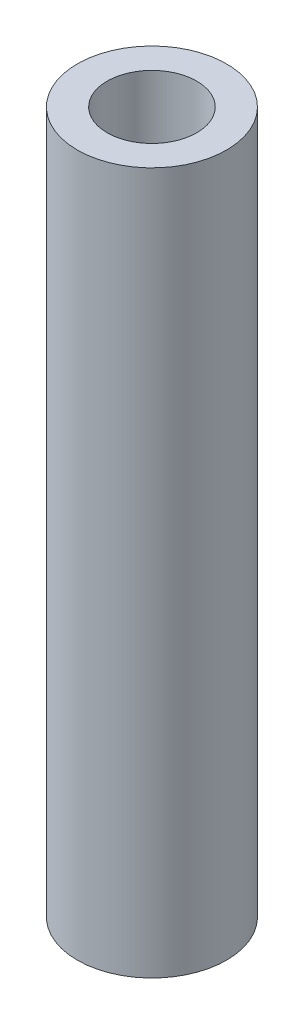
ISO-10303-21;
HEADER;
FILE_DESCRIPTION(('STEP AP214'),'2;1');
FILE_NAME('part.step','',(''),(''),'','','');
FILE_SCHEMA(('AUTOMOTIVE_DESIGN { 1 0 10303 214 1 1 1 1 }'));
ENDSEC;
DATA;
#1=APPLICATION_CONTEXT('core data for automotive mechanical design processes');
#2=APPLICATION_PROTOCOL_DEFINITION('international standard','automotive_design',2000,#1);
#3=PRODUCT_CONTEXT('',#1,'mechanical');
#4=PRODUCT('Part','Part','',(#3));
#5=PRODUCT_RELATED_PRODUCT_CATEGORY('part','',(#4));
#6=PRODUCT_DEFINITION_FORMATION('','',#4);
#7=PRODUCT_DEFINITION_CONTEXT('part definition',#1,'design');
#8=PRODUCT_DEFINITION('design','',#6,#7);
#9=PRODUCT_DEFINITION_SHAPE('','',#8);
#10=(LENGTH_UNIT() NAMED_UNIT(*) SI_UNIT(.MILLI.,.METRE.));
#11=(NAMED_UNIT(*) PLANE_ANGLE_UNIT() SI_UNIT($,.RADIAN.));
#12=(NAMED_UNIT(*) SI_UNIT($,.STERADIAN.) SOLID_ANGLE_UNIT());
#13=UNCERTAINTY_MEASURE_WITH_UNIT(LENGTH_MEASURE(1.E-05),#10,'distance_accuracy_value','');
#14=(GEOMETRIC_REPRESENTATION_CONTEXT(3) GLOBAL_UNCERTAINTY_ASSIGNED_CONTEXT((#13)) GLOBAL_UNIT_ASSIGNED_CONTEXT((#10,
#11,#12)) REPRESENTATION_CONTEXT('',''));
#15=CARTESIAN_POINT('',(0.,0.,0.));
#16=DIRECTION('',(0.,0.,1.));
#17=DIRECTION('',(1.,0.,0.));
#18=AXIS2_PLACEMENT_3D('',#15,#16,#17);
#19=CARTESIAN_POINT('',(0.,47.,0.));
#20=DIRECTION('',(0.,1.,0.));
#21=DIRECTION('',(0.,0.,1.));
#22=AXIS2_PLACEMENT_3D('',#19,#20,#21);
#23=PLANE('',#22);
#24=CARTESIAN_POINT('',(0.,47.,0.));
#25=DIRECTION('',(0.,1.,0.));
#26=DIRECTION('',(0.,0.,1.));
#27=AXIS2_PLACEMENT_3D('',#24,#25,#26);
#28=CIRCLE('',#27,5.);
#29=CARTESIAN_POINT('',(0.,47.,5.));
#30=VERTEX_POINT('',#29);
#31=EDGE_CURVE('E10',#30,#30,#28,.T.);
#32=ORIENTED_EDGE('',*,*,#31,.T.);
#33=EDGE_LOOP('',(#32));
#34=FACE_BOUND('',#33,.T.);
#35=CARTESIAN_POINT('',(0.,47.,0.));
#36=DIRECTION('',(0.,1.,0.));
#37=DIRECTION('',(0.,0.,1.));
#38=AXIS2_PLACEMENT_3D('',#35,#36,#37);
#39=CIRCLE('',#38,3.);
#40=CARTESIAN_POINT('',(0.,47.,3.));
#41=VERTEX_POINT('',#40);
#42=EDGE_CURVE('E39',#41,#41,#39,.T.);
#43=ORIENTED_EDGE('',*,*,#42,.F.);
#44=EDGE_LOOP('',(#43));
#45=FACE_BOUND('',#44,.T.);
#46=ADVANCED_FACE('F28',(#34,#45),#23,.T.);
#47=CARTESIAN_POINT('',(0.,0.,0.));
#48=DIRECTION('',(0.,1.,0.));
#49=DIRECTION('',(0.,0.,1.));
#50=AXIS2_PLACEMENT_3D('',#47,#48,#49);
#51=PLANE('',#50);
#52=CARTESIAN_POINT('',(0.,0.,0.));
#53=DIRECTION('',(0.,1.,0.));
#54=DIRECTION('',(0.,0.,1.));
#55=AXIS2_PLACEMENT_3D('',#52,#53,#54);
#56=CIRCLE('',#55,5.);
#57=CARTESIAN_POINT('',(0.,0.,5.));
#58=VERTEX_POINT('',#57);
#59=EDGE_CURVE('E32',#58,#58,#56,.T.);
#60=ORIENTED_EDGE('',*,*,#59,.F.);
#61=EDGE_LOOP('',(#60));
#62=FACE_BOUND('',#61,.T.);
#63=CARTESIAN_POINT('',(0.,0.,0.));
#64=DIRECTION('',(0.,1.,0.));
#65=DIRECTION('',(0.,0.,1.));
#66=AXIS2_PLACEMENT_3D('',#63,#64,#65);
#67=CIRCLE('',#66,3.);
#68=CARTESIAN_POINT('',(0.,0.,3.));
#69=VERTEX_POINT('',#68);
#70=EDGE_CURVE('E41',#69,#69,#67,.T.);
#71=ORIENTED_EDGE('',*,*,#70,.T.);
#72=EDGE_LOOP('',(#71));
#73=FACE_BOUND('',#72,.T.);
#74=ADVANCED_FACE('F51',(#62,#73),#51,.F.);
#75=CARTESIAN_POINT('',(0.,47.,0.));
#76=DIRECTION('',(0.,-1.,0.));
#77=DIRECTION('',(0.,0.,-1.));
#78=AXIS2_PLACEMENT_3D('',#75,#76,#77);
#79=CYLINDRICAL_SURFACE('',#78,5.);
#80=ORIENTED_EDGE('',*,*,#31,.F.);
#81=EDGE_LOOP('',(#80));
#82=FACE_BOUND('',#81,.T.);
#83=ORIENTED_EDGE('',*,*,#59,.T.);
#84=EDGE_LOOP('',(#83));
#85=FACE_BOUND('',#84,.T.);
#86=ADVANCED_FACE('F30',(#82,#85),#79,.T.);
#87=CARTESIAN_POINT('',(0.,47.,0.));
#88=DIRECTION('',(0.,-1.,0.));
#89=DIRECTION('',(0.,0.,-1.));
#90=AXIS2_PLACEMENT_3D('',#87,#88,#89);
#91=CYLINDRICAL_SURFACE('',#90,3.);
#92=ORIENTED_EDGE('',*,*,#42,.T.);
#93=EDGE_LOOP('',(#92));
#94=FACE_BOUND('',#93,.T.);
#95=ORIENTED_EDGE('',*,*,#70,.F.);
#96=EDGE_LOOP('',(#95));
#97=FACE_BOUND('',#96,.T.);
#98=ADVANCED_FACE('F47',(#94,#97),#91,.F.);
#99=CLOSED_SHELL('',(#46,#74,#86,#98));
#100=MANIFOLD_SOLID_BREP('B2',#99);
#101=ADVANCED_BREP_SHAPE_REPRESENTATION('',(#18,#100),#14);
#102=SHAPE_DEFINITION_REPRESENTATION(#9,#101);
ENDSEC;
END-ISO-10303-21;
